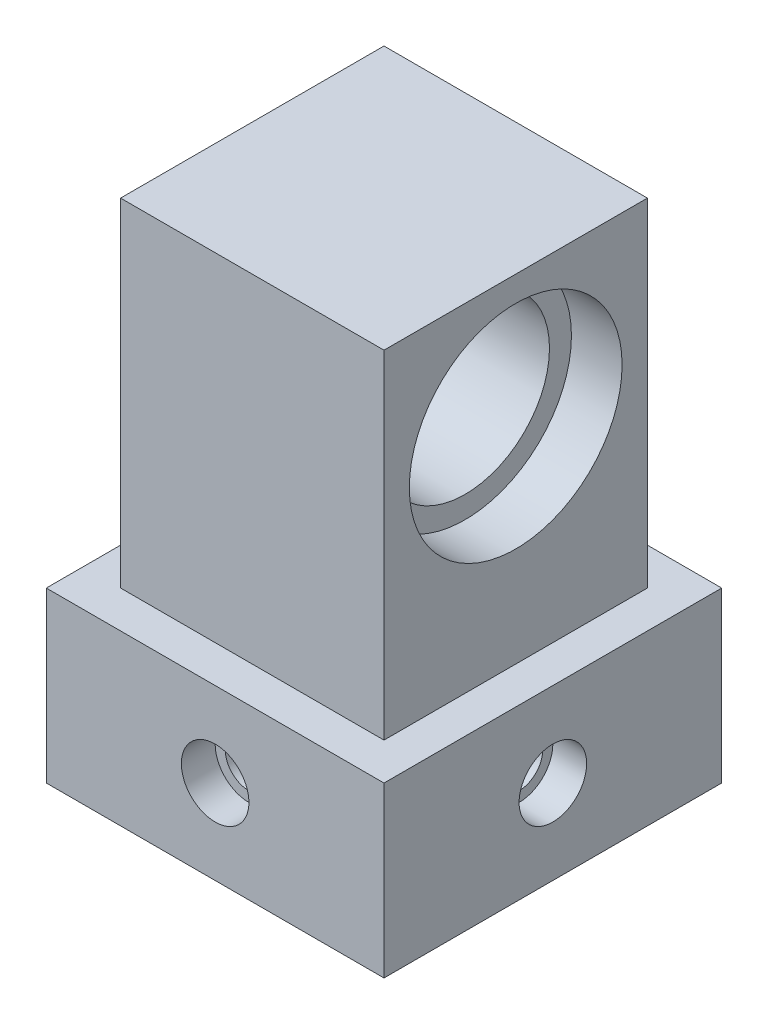
ISO-10303-21;
HEADER;
FILE_DESCRIPTION(('STEP AP214'),'2;1');
FILE_NAME('part.step','',(''),(''),'','','');
FILE_SCHEMA(('AUTOMOTIVE_DESIGN { 1 0 10303 214 1 1 1 1 }'));
ENDSEC;
DATA;
#1=APPLICATION_CONTEXT('core data for automotive mechanical design processes');
#2=APPLICATION_PROTOCOL_DEFINITION('international standard','automotive_design',2000,#1);
#3=PRODUCT_CONTEXT('',#1,'mechanical');
#4=PRODUCT('Part','Part','',(#3));
#5=PRODUCT_RELATED_PRODUCT_CATEGORY('part','',(#4));
#6=PRODUCT_DEFINITION_FORMATION('','',#4);
#7=PRODUCT_DEFINITION_CONTEXT('part definition',#1,'design');
#8=PRODUCT_DEFINITION('design','',#6,#7);
#9=PRODUCT_DEFINITION_SHAPE('','',#8);
#10=(LENGTH_UNIT() NAMED_UNIT(*) SI_UNIT(.MILLI.,.METRE.));
#11=(NAMED_UNIT(*) PLANE_ANGLE_UNIT() SI_UNIT($,.RADIAN.));
#12=(NAMED_UNIT(*) SI_UNIT($,.STERADIAN.) SOLID_ANGLE_UNIT());
#13=UNCERTAINTY_MEASURE_WITH_UNIT(LENGTH_MEASURE(1.E-05),#10,'distance_accuracy_value','');
#14=(GEOMETRIC_REPRESENTATION_CONTEXT(3) GLOBAL_UNCERTAINTY_ASSIGNED_CONTEXT((#13)) GLOBAL_UNIT_ASSIGNED_CONTEXT((#10,
#11,#12)) REPRESENTATION_CONTEXT('',''));
#15=CARTESIAN_POINT('',(0.,0.,0.));
#16=DIRECTION('',(0.,0.,1.));
#17=DIRECTION('',(1.,0.,0.));
#18=AXIS2_PLACEMENT_3D('',#15,#16,#17);
#19=CARTESIAN_POINT('',(0.,2.5,5.001));
#20=DIRECTION('',(0.,0.,-1.));
#21=DIRECTION('',(-1.,0.,0.));
#22=AXIS2_PLACEMENT_3D('',#19,#20,#21);
#23=CYLINDRICAL_SURFACE('',#22,0.7);
#24=CARTESIAN_POINT('',(0.,2.5,-3.1));
#25=DIRECTION('',(0.,0.,-1.));
#26=DIRECTION('',(-1.,0.,0.));
#27=AXIS2_PLACEMENT_3D('',#24,#25,#26);
#28=CIRCLE('',#27,0.7);
#29=CARTESIAN_POINT('',(-0.7,2.5,-3.1));
#30=VERTEX_POINT('',#29);
#31=EDGE_CURVE('E281',#30,#30,#28,.F.);
#32=ORIENTED_EDGE('',*,*,#31,.T.);
#33=EDGE_LOOP('',(#32));
#34=FACE_BOUND('',#33,.T.);
#35=CARTESIAN_POINT('',(0.,2.5,-4.));
#36=DIRECTION('',(0.,0.,-1.));
#37=DIRECTION('',(-1.,0.,0.));
#38=AXIS2_PLACEMENT_3D('',#35,#36,#37);
#39=CIRCLE('',#38,0.7);
#40=CARTESIAN_POINT('',(-0.7,2.5,-4.));
#41=VERTEX_POINT('',#40);
#42=EDGE_CURVE('E271',#41,#41,#39,.F.);
#43=ORIENTED_EDGE('',*,*,#42,.F.);
#44=EDGE_LOOP('',(#43));
#45=FACE_BOUND('',#44,.T.);
#46=ADVANCED_FACE('F59',(#34,#45),#23,.F.);
#47=CARTESIAN_POINT('',(-5.,11.1,0.));
#48=DIRECTION('',(1.,0.,0.));
#49=DIRECTION('',(0.,0.,-1.));
#50=AXIS2_PLACEMENT_3D('',#47,#48,#49);
#51=CYLINDRICAL_SURFACE('',#50,2.5);
#52=CARTESIAN_POINT('',(2.4,11.1,0.));
#53=DIRECTION('',(1.,0.,0.));
#54=DIRECTION('',(0.,0.,-1.));
#55=AXIS2_PLACEMENT_3D('',#52,#53,#54);
#56=CIRCLE('',#55,2.5);
#57=CARTESIAN_POINT('',(2.4,11.1,-2.5));
#58=VERTEX_POINT('',#57);
#59=EDGE_CURVE('E343',#58,#58,#56,.T.);
#60=ORIENTED_EDGE('',*,*,#59,.T.);
#61=EDGE_LOOP('',(#60));
#62=FACE_BOUND('',#61,.T.);
#63=CARTESIAN_POINT('',(-2.4,11.1,0.));
#64=DIRECTION('',(-1.,0.,0.));
#65=DIRECTION('',(0.,0.,1.));
#66=AXIS2_PLACEMENT_3D('',#63,#64,#65);
#67=CIRCLE('',#66,2.5);
#68=CARTESIAN_POINT('',(-2.4,11.1,2.5));
#69=VERTEX_POINT('',#68);
#70=EDGE_CURVE('E327',#69,#69,#67,.T.);
#71=ORIENTED_EDGE('',*,*,#70,.T.);
#72=EDGE_LOOP('',(#71));
#73=FACE_BOUND('',#72,.T.);
#74=ADVANCED_FACE('F379',(#62,#73),#51,.F.);
#75=CARTESIAN_POINT('',(0.,5.,0.));
#76=DIRECTION('',(0.,-1.,0.));
#77=DIRECTION('',(0.,0.,-1.));
#78=AXIS2_PLACEMENT_3D('',#75,#76,#77);
#79=PLANE('',#78);
#80=DIRECTION('',(0.,0.,1.));
#81=VECTOR('',#80,1.);
#82=CARTESIAN_POINT('',(-5.,5.,0.));
#83=LINE('',#82,#81);
#84=CARTESIAN_POINT('',(-5.,5.,-5.));
#85=VERTEX_POINT('',#84);
#86=CARTESIAN_POINT('',(-5.,5.,5.));
#87=VERTEX_POINT('',#86);
#88=EDGE_CURVE('E188',#85,#87,#83,.T.);
#89=ORIENTED_EDGE('',*,*,#88,.T.);
#90=DIRECTION('',(-1.,0.,0.));
#91=VECTOR('',#90,1.);
#92=CARTESIAN_POINT('',(0.,5.,5.));
#93=LINE('',#92,#91);
#94=CARTESIAN_POINT('',(5.,5.,5.));
#95=VERTEX_POINT('',#94);
#96=EDGE_CURVE('E193',#95,#87,#93,.T.);
#97=ORIENTED_EDGE('',*,*,#96,.F.);
#98=DIRECTION('',(0.,0.,1.));
#99=VECTOR('',#98,1.);
#100=CARTESIAN_POINT('',(5.,5.,0.));
#101=LINE('',#100,#99);
#102=CARTESIAN_POINT('',(5.,5.,-5.));
#103=VERTEX_POINT('',#102);
#104=EDGE_CURVE('E197',#103,#95,#101,.T.);
#105=ORIENTED_EDGE('',*,*,#104,.F.);
#106=DIRECTION('',(-1.,0.,0.));
#107=VECTOR('',#106,1.);
#108=CARTESIAN_POINT('',(0.,5.,-5.));
#109=LINE('',#108,#107);
#110=EDGE_CURVE('E201',#103,#85,#109,.T.);
#111=ORIENTED_EDGE('',*,*,#110,.T.);
#112=EDGE_LOOP('',(#89,#97,#105,#111));
#113=FACE_BOUND('',#112,.T.);
#114=DIRECTION('',(1.,0.,0.));
#115=VECTOR('',#114,1.);
#116=CARTESIAN_POINT('',(-3.9,5.,3.9));
#117=LINE('',#116,#115);
#118=CARTESIAN_POINT('',(-3.9,5.,3.9));
#119=VERTEX_POINT('',#118);
#120=CARTESIAN_POINT('',(3.9,5.,3.9));
#121=VERTEX_POINT('',#120);
#122=EDGE_CURVE('E77',#119,#121,#117,.T.);
#123=ORIENTED_EDGE('',*,*,#122,.F.);
#124=DIRECTION('',(0.,0.,-1.));
#125=VECTOR('',#124,1.);
#126=CARTESIAN_POINT('',(-3.9,5.,3.9));
#127=LINE('',#126,#125);
#128=CARTESIAN_POINT('',(-3.9,5.,-3.9));
#129=VERTEX_POINT('',#128);
#130=EDGE_CURVE('E82',#119,#129,#127,.T.);
#131=ORIENTED_EDGE('',*,*,#130,.T.);
#132=DIRECTION('',(1.,0.,0.));
#133=VECTOR('',#132,1.);
#134=CARTESIAN_POINT('',(-3.9,5.,-3.9));
#135=LINE('',#134,#133);
#136=CARTESIAN_POINT('',(3.9,5.,-3.9));
#137=VERTEX_POINT('',#136);
#138=EDGE_CURVE('E364',#129,#137,#135,.T.);
#139=ORIENTED_EDGE('',*,*,#138,.T.);
#140=DIRECTION('',(0.,0.,-1.));
#141=VECTOR('',#140,1.);
#142=CARTESIAN_POINT('',(3.9,5.,3.9));
#143=LINE('',#142,#141);
#144=EDGE_CURVE('E361',#121,#137,#143,.T.);
#145=ORIENTED_EDGE('',*,*,#144,.F.);
#146=EDGE_LOOP('',(#123,#131,#139,#145));
#147=FACE_BOUND('',#146,.T.);
#148=ADVANCED_FACE('F376',(#113,#147),#79,.F.);
#149=CARTESIAN_POINT('',(0.,4.,5.));
#150=DIRECTION('',(0.,0.,-1.));
#151=DIRECTION('',(-1.,0.,0.));
#152=AXIS2_PLACEMENT_3D('',#149,#150,#151);
#153=PLANE('',#152);
#154=CARTESIAN_POINT('',(0.,2.5,5.));
#155=DIRECTION('',(0.,0.,-1.));
#156=DIRECTION('',(-1.,0.,0.));
#157=AXIS2_PLACEMENT_3D('',#154,#155,#156);
#158=CIRCLE('',#157,1.);
#159=CARTESIAN_POINT('',(-1.,2.5,5.));
#160=VERTEX_POINT('',#159);
#161=EDGE_CURVE('E292',#160,#160,#158,.T.);
#162=ORIENTED_EDGE('',*,*,#161,.T.);
#163=EDGE_LOOP('',(#162));
#164=FACE_BOUND('',#163,.T.);
#165=DIRECTION('',(1.,0.,0.));
#166=VECTOR('',#165,1.);
#167=CARTESIAN_POINT('',(0.,0.,5.));
#168=LINE('',#167,#166);
#169=CARTESIAN_POINT('',(-5.,0.,5.));
#170=VERTEX_POINT('',#169);
#171=CARTESIAN_POINT('',(5.,0.,5.));
#172=VERTEX_POINT('',#171);
#173=EDGE_CURVE('E237',#170,#172,#168,.T.);
#174=ORIENTED_EDGE('',*,*,#173,.T.);
#175=DIRECTION('',(0.,-1.,0.));
#176=VECTOR('',#175,1.);
#177=CARTESIAN_POINT('',(5.,4.,5.));
#178=LINE('',#177,#176);
#179=EDGE_CURVE('E12',#95,#172,#178,.T.);
#180=ORIENTED_EDGE('',*,*,#179,.F.);
#181=ORIENTED_EDGE('',*,*,#96,.T.);
#182=DIRECTION('',(0.,-1.,0.));
#183=VECTOR('',#182,1.);
#184=CARTESIAN_POINT('',(-5.,4.,5.));
#185=LINE('',#184,#183);
#186=EDGE_CURVE('E252',#87,#170,#185,.T.);
#187=ORIENTED_EDGE('',*,*,#186,.T.);
#188=EDGE_LOOP('',(#174,#180,#181,#187));
#189=FACE_BOUND('',#188,.T.);
#190=ADVANCED_FACE('F378',(#164,#189),#153,.F.);
#191=CARTESIAN_POINT('',(5.,4.,0.));
#192=DIRECTION('',(-1.,0.,0.));
#193=DIRECTION('',(0.,0.,1.));
#194=AXIS2_PLACEMENT_3D('',#191,#192,#193);
#195=PLANE('',#194);
#196=CARTESIAN_POINT('',(5.,2.5,0.));
#197=DIRECTION('',(1.,0.,0.));
#198=DIRECTION('',(0.,0.,-1.));
#199=AXIS2_PLACEMENT_3D('',#196,#197,#198);
#200=CIRCLE('',#199,1.);
#201=CARTESIAN_POINT('',(5.,2.5,-1.));
#202=VERTEX_POINT('',#201);
#203=EDGE_CURVE('E319',#202,#202,#200,.T.);
#204=ORIENTED_EDGE('',*,*,#203,.F.);
#205=EDGE_LOOP('',(#204));
#206=FACE_BOUND('',#205,.T.);
#207=DIRECTION('',(0.,0.,-1.));
#208=VECTOR('',#207,1.);
#209=CARTESIAN_POINT('',(5.,0.,0.));
#210=LINE('',#209,#208);
#211=CARTESIAN_POINT('',(5.,0.,-5.));
#212=VERTEX_POINT('',#211);
#213=EDGE_CURVE('E241',#172,#212,#210,.T.);
#214=ORIENTED_EDGE('',*,*,#213,.T.);
#215=DIRECTION('',(0.,-1.,0.));
#216=VECTOR('',#215,1.);
#217=CARTESIAN_POINT('',(5.,4.,-5.));
#218=LINE('',#217,#216);
#219=EDGE_CURVE('E69',#103,#212,#218,.T.);
#220=ORIENTED_EDGE('',*,*,#219,.F.);
#221=ORIENTED_EDGE('',*,*,#104,.T.);
#222=ORIENTED_EDGE('',*,*,#179,.T.);
#223=EDGE_LOOP('',(#214,#220,#221,#222));
#224=FACE_BOUND('',#223,.T.);
#225=ADVANCED_FACE('F387',(#206,#224),#195,.F.);
#226=CARTESIAN_POINT('',(0.,4.,-5.));
#227=DIRECTION('',(0.,0.,-1.));
#228=DIRECTION('',(-1.,0.,0.));
#229=AXIS2_PLACEMENT_3D('',#226,#227,#228);
#230=PLANE('',#229);
#231=CARTESIAN_POINT('',(0.,2.5,-5.));
#232=DIRECTION('',(0.,0.,-1.));
#233=DIRECTION('',(-1.,0.,0.));
#234=AXIS2_PLACEMENT_3D('',#231,#232,#233);
#235=CIRCLE('',#234,1.);
#236=CARTESIAN_POINT('',(-1.,2.5,-5.));
#237=VERTEX_POINT('',#236);
#238=EDGE_CURVE('E284',#237,#237,#235,.T.);
#239=ORIENTED_EDGE('',*,*,#238,.F.);
#240=EDGE_LOOP('',(#239));
#241=FACE_BOUND('',#240,.T.);
#242=DIRECTION('',(1.,0.,0.));
#243=VECTOR('',#242,1.);
#244=CARTESIAN_POINT('',(0.,0.,-5.));
#245=LINE('',#244,#243);
#246=CARTESIAN_POINT('',(-5.,0.,-5.));
#247=VERTEX_POINT('',#246);
#248=EDGE_CURVE('E245',#247,#212,#245,.T.);
#249=ORIENTED_EDGE('',*,*,#248,.F.);
#250=DIRECTION('',(0.,-1.,0.));
#251=VECTOR('',#250,1.);
#252=CARTESIAN_POINT('',(-5.,4.,-5.));
#253=LINE('',#252,#251);
#254=EDGE_CURVE('E255',#85,#247,#253,.T.);
#255=ORIENTED_EDGE('',*,*,#254,.F.);
#256=ORIENTED_EDGE('',*,*,#110,.F.);
#257=ORIENTED_EDGE('',*,*,#219,.T.);
#258=EDGE_LOOP('',(#249,#255,#256,#257));
#259=FACE_BOUND('',#258,.T.);
#260=ADVANCED_FACE('F516',(#241,#259),#230,.T.);
#261=CARTESIAN_POINT('',(3.1,4.,0.));
#262=DIRECTION('',(-1.,0.,0.));
#263=DIRECTION('',(0.,0.,1.));
#264=AXIS2_PLACEMENT_3D('',#261,#262,#263);
#265=PLANE('',#264);
#266=CARTESIAN_POINT('',(3.1,2.5,0.));
#267=DIRECTION('',(-1.,0.,0.));
#268=DIRECTION('',(0.,0.,1.));
#269=AXIS2_PLACEMENT_3D('',#266,#267,#268);
#270=CIRCLE('',#269,0.7);
#271=CARTESIAN_POINT('',(3.1,2.5,0.7));
#272=VERTEX_POINT('',#271);
#273=EDGE_CURVE('E306',#272,#272,#270,.F.);
#274=ORIENTED_EDGE('',*,*,#273,.T.);
#275=EDGE_LOOP('',(#274));
#276=FACE_BOUND('',#275,.T.);
#277=DIRECTION('',(0.,0.,-1.));
#278=VECTOR('',#277,1.);
#279=CARTESIAN_POINT('',(3.1,0.,0.));
#280=LINE('',#279,#278);
#281=CARTESIAN_POINT('',(3.1,0.,3.1));
#282=VERTEX_POINT('',#281);
#283=CARTESIAN_POINT('',(3.1,0.,-3.1));
#284=VERTEX_POINT('',#283);
#285=EDGE_CURVE('E205',#282,#284,#280,.T.);
#286=ORIENTED_EDGE('',*,*,#285,.F.);
#287=DIRECTION('',(0.,-1.,0.));
#288=VECTOR('',#287,1.);
#289=CARTESIAN_POINT('',(3.1,4.,3.1));
#290=LINE('',#289,#288);
#291=CARTESIAN_POINT('',(3.1,4.,3.1));
#292=VERTEX_POINT('',#291);
#293=EDGE_CURVE('E256',#292,#282,#290,.T.);
#294=ORIENTED_EDGE('',*,*,#293,.F.);
#295=DIRECTION('',(0.,0.,-1.));
#296=VECTOR('',#295,1.);
#297=CARTESIAN_POINT('',(3.1,4.,0.));
#298=LINE('',#297,#296);
#299=CARTESIAN_POINT('',(3.1,4.,-3.1));
#300=VERTEX_POINT('',#299);
#301=EDGE_CURVE('E206',#292,#300,#298,.T.);
#302=ORIENTED_EDGE('',*,*,#301,.T.);
#303=DIRECTION('',(0.,-1.,0.));
#304=VECTOR('',#303,1.);
#305=CARTESIAN_POINT('',(3.1,4.,-3.1));
#306=LINE('',#305,#304);
#307=EDGE_CURVE('E222',#300,#284,#306,.T.);
#308=ORIENTED_EDGE('',*,*,#307,.T.);
#309=EDGE_LOOP('',(#286,#294,#302,#308));
#310=FACE_BOUND('',#309,.T.);
#311=ADVANCED_FACE('F61',(#276,#310),#265,.T.);
#312=CARTESIAN_POINT('',(0.,4.,3.1));
#313=DIRECTION('',(0.,0.,-1.));
#314=DIRECTION('',(-1.,0.,0.));
#315=AXIS2_PLACEMENT_3D('',#312,#313,#314);
#316=PLANE('',#315);
#317=CARTESIAN_POINT('',(0.,2.5,3.1));
#318=DIRECTION('',(0.,0.,-1.));
#319=DIRECTION('',(-1.,0.,0.));
#320=AXIS2_PLACEMENT_3D('',#317,#318,#319);
#321=CIRCLE('',#320,0.7);
#322=CARTESIAN_POINT('',(-0.7,2.5,3.1));
#323=VERTEX_POINT('',#322);
#324=EDGE_CURVE('E274',#323,#323,#321,.T.);
#325=ORIENTED_EDGE('',*,*,#324,.F.);
#326=EDGE_LOOP('',(#325));
#327=FACE_BOUND('',#326,.T.);
#328=DIRECTION('',(1.,0.,0.));
#329=VECTOR('',#328,1.);
#330=CARTESIAN_POINT('',(0.,0.,3.1));
#331=LINE('',#330,#329);
#332=CARTESIAN_POINT('',(-3.1,0.,3.1));
#333=VERTEX_POINT('',#332);
#334=EDGE_CURVE('E226',#333,#282,#331,.T.);
#335=ORIENTED_EDGE('',*,*,#334,.F.);
#336=DIRECTION('',(0.,-1.,0.));
#337=VECTOR('',#336,1.);
#338=CARTESIAN_POINT('',(-3.1,4.,3.1));
#339=LINE('',#338,#337);
#340=CARTESIAN_POINT('',(-3.1,4.,3.1));
#341=VERTEX_POINT('',#340);
#342=EDGE_CURVE('E267',#341,#333,#339,.T.);
#343=ORIENTED_EDGE('',*,*,#342,.F.);
#344=DIRECTION('',(1.,0.,0.));
#345=VECTOR('',#344,1.);
#346=CARTESIAN_POINT('',(0.,4.,3.1));
#347=LINE('',#346,#345);
#348=EDGE_CURVE('E209',#341,#292,#347,.T.);
#349=ORIENTED_EDGE('',*,*,#348,.T.);
#350=ORIENTED_EDGE('',*,*,#293,.T.);
#351=EDGE_LOOP('',(#335,#343,#349,#350));
#352=FACE_BOUND('',#351,.T.);
#353=ADVANCED_FACE('F561',(#327,#352),#316,.T.);
#354=CARTESIAN_POINT('',(-3.1,4.,0.));
#355=DIRECTION('',(-1.,0.,0.));
#356=DIRECTION('',(0.,0.,1.));
#357=AXIS2_PLACEMENT_3D('',#354,#355,#356);
#358=PLANE('',#357);
#359=CARTESIAN_POINT('',(-3.1,2.5,0.));
#360=DIRECTION('',(-1.,0.,0.));
#361=DIRECTION('',(0.,0.,1.));
#362=AXIS2_PLACEMENT_3D('',#359,#360,#361);
#363=CIRCLE('',#362,0.7);
#364=CARTESIAN_POINT('',(-3.1,2.5,0.7));
#365=VERTEX_POINT('',#364);
#366=EDGE_CURVE('E298',#365,#365,#363,.F.);
#367=ORIENTED_EDGE('',*,*,#366,.F.);
#368=EDGE_LOOP('',(#367));
#369=FACE_BOUND('',#368,.T.);
#370=DIRECTION('',(0.,0.,-1.));
#371=VECTOR('',#370,1.);
#372=CARTESIAN_POINT('',(-3.1,0.,0.));
#373=LINE('',#372,#371);
#374=CARTESIAN_POINT('',(-3.1,0.,-3.1));
#375=VERTEX_POINT('',#374);
#376=EDGE_CURVE('E230',#333,#375,#373,.T.);
#377=ORIENTED_EDGE('',*,*,#376,.T.);
#378=DIRECTION('',(0.,-1.,0.));
#379=VECTOR('',#378,1.);
#380=CARTESIAN_POINT('',(-3.1,4.,-3.1));
#381=LINE('',#380,#379);
#382=CARTESIAN_POINT('',(-3.1,4.,-3.1));
#383=VERTEX_POINT('',#382);
#384=EDGE_CURVE('E263',#383,#375,#381,.T.);
#385=ORIENTED_EDGE('',*,*,#384,.F.);
#386=DIRECTION('',(0.,0.,-1.));
#387=VECTOR('',#386,1.);
#388=CARTESIAN_POINT('',(-3.1,4.,0.));
#389=LINE('',#388,#387);
#390=EDGE_CURVE('E214',#341,#383,#389,.T.);
#391=ORIENTED_EDGE('',*,*,#390,.F.);
#392=ORIENTED_EDGE('',*,*,#342,.T.);
#393=EDGE_LOOP('',(#377,#385,#391,#392));
#394=FACE_BOUND('',#393,.T.);
#395=ADVANCED_FACE('F572',(#369,#394),#358,.F.);
#396=CARTESIAN_POINT('',(0.,4.,-3.1));
#397=DIRECTION('',(0.,0.,-1.));
#398=DIRECTION('',(-1.,0.,0.));
#399=AXIS2_PLACEMENT_3D('',#396,#397,#398);
#400=PLANE('',#399);
#401=ORIENTED_EDGE('',*,*,#31,.F.);
#402=EDGE_LOOP('',(#401));
#403=FACE_BOUND('',#402,.T.);
#404=DIRECTION('',(1.,0.,0.));
#405=VECTOR('',#404,1.);
#406=CARTESIAN_POINT('',(0.,0.,-3.1));
#407=LINE('',#406,#405);
#408=EDGE_CURVE('E233',#375,#284,#407,.T.);
#409=ORIENTED_EDGE('',*,*,#408,.T.);
#410=ORIENTED_EDGE('',*,*,#307,.F.);
#411=DIRECTION('',(1.,0.,0.));
#412=VECTOR('',#411,1.);
#413=CARTESIAN_POINT('',(0.,4.,-3.1));
#414=LINE('',#413,#412);
#415=EDGE_CURVE('E218',#383,#300,#414,.T.);
#416=ORIENTED_EDGE('',*,*,#415,.F.);
#417=ORIENTED_EDGE('',*,*,#384,.T.);
#418=EDGE_LOOP('',(#409,#410,#416,#417));
#419=FACE_BOUND('',#418,.T.);
#420=ADVANCED_FACE('F539',(#403,#419),#400,.F.);
#421=CARTESIAN_POINT('',(-5.,4.,0.));
#422=DIRECTION('',(-1.,0.,0.));
#423=DIRECTION('',(0.,0.,1.));
#424=AXIS2_PLACEMENT_3D('',#421,#422,#423);
#425=PLANE('',#424);
#426=CARTESIAN_POINT('',(-5.,2.5,0.));
#427=DIRECTION('',(-1.,0.,0.));
#428=DIRECTION('',(0.,0.,1.));
#429=AXIS2_PLACEMENT_3D('',#426,#427,#428);
#430=CIRCLE('',#429,1.);
#431=CARTESIAN_POINT('',(-5.,2.5,1.));
#432=VERTEX_POINT('',#431);
#433=EDGE_CURVE('E314',#432,#432,#430,.T.);
#434=ORIENTED_EDGE('',*,*,#433,.F.);
#435=EDGE_LOOP('',(#434));
#436=FACE_BOUND('',#435,.T.);
#437=DIRECTION('',(0.,0.,-1.));
#438=VECTOR('',#437,1.);
#439=CARTESIAN_POINT('',(-5.,0.,0.));
#440=LINE('',#439,#438);
#441=EDGE_CURVE('E210',#170,#247,#440,.T.);
#442=ORIENTED_EDGE('',*,*,#441,.F.);
#443=ORIENTED_EDGE('',*,*,#186,.F.);
#444=ORIENTED_EDGE('',*,*,#88,.F.);
#445=ORIENTED_EDGE('',*,*,#254,.T.);
#446=EDGE_LOOP('',(#442,#443,#444,#445));
#447=FACE_BOUND('',#446,.T.);
#448=ADVANCED_FACE('F534',(#436,#447),#425,.T.);
#449=CARTESIAN_POINT('',(0.,0.,0.));
#450=DIRECTION('',(0.,1.,0.));
#451=DIRECTION('',(0.,0.,1.));
#452=AXIS2_PLACEMENT_3D('',#449,#450,#451);
#453=PLANE('',#452);
#454=ORIENTED_EDGE('',*,*,#285,.T.);
#455=ORIENTED_EDGE('',*,*,#408,.F.);
#456=ORIENTED_EDGE('',*,*,#376,.F.);
#457=ORIENTED_EDGE('',*,*,#334,.T.);
#458=EDGE_LOOP('',(#454,#455,#456,#457));
#459=FACE_BOUND('',#458,.T.);
#460=ORIENTED_EDGE('',*,*,#173,.F.);
#461=ORIENTED_EDGE('',*,*,#441,.T.);
#462=ORIENTED_EDGE('',*,*,#248,.T.);
#463=ORIENTED_EDGE('',*,*,#213,.F.);
#464=EDGE_LOOP('',(#460,#461,#462,#463));
#465=FACE_BOUND('',#464,.T.);
#466=ADVANCED_FACE('F538',(#459,#465),#453,.F.);
#467=CARTESIAN_POINT('',(0.,4.,0.));
#468=DIRECTION('',(0.,-1.,0.));
#469=DIRECTION('',(0.,0.,-1.));
#470=AXIS2_PLACEMENT_3D('',#467,#468,#469);
#471=PLANE('',#470);
#472=CARTESIAN_POINT('',(0.,4.,0.));
#473=DIRECTION('',(0.,1.,0.));
#474=DIRECTION('',(0.,0.,1.));
#475=AXIS2_PLACEMENT_3D('',#472,#473,#474);
#476=CIRCLE('',#475,1.25);
#477=CARTESIAN_POINT('',(0.,4.,1.25));
#478=VERTEX_POINT('',#477);
#479=EDGE_CURVE('E175',#478,#478,#476,.T.);
#480=ORIENTED_EDGE('',*,*,#479,.T.);
#481=EDGE_LOOP('',(#480));
#482=FACE_BOUND('',#481,.T.);
#483=ORIENTED_EDGE('',*,*,#301,.F.);
#484=ORIENTED_EDGE('',*,*,#348,.F.);
#485=ORIENTED_EDGE('',*,*,#390,.T.);
#486=ORIENTED_EDGE('',*,*,#415,.T.);
#487=EDGE_LOOP('',(#483,#484,#485,#486));
#488=FACE_BOUND('',#487,.T.);
#489=ADVANCED_FACE('F459',(#482,#488),#471,.T.);
#490=CARTESIAN_POINT('',(0.,4.,0.));
#491=DIRECTION('',(0.,-1.,0.));
#492=DIRECTION('',(0.,0.,-1.));
#493=AXIS2_PLACEMENT_3D('',#490,#491,#492);
#494=CYLINDRICAL_SURFACE('',#493,1.25);
#495=ORIENTED_EDGE('',*,*,#479,.F.);
#496=EDGE_LOOP('',(#495));
#497=FACE_BOUND('',#496,.T.);
#498=CARTESIAN_POINT('',(0.,0.,0.));
#499=DIRECTION('',(0.,1.,0.));
#500=DIRECTION('',(0.,0.,1.));
#501=AXIS2_PLACEMENT_3D('',#498,#499,#500);
#502=CIRCLE('',#501,1.25);
#503=CARTESIAN_POINT('',(0.,0.,1.25));
#504=VERTEX_POINT('',#503);
#505=EDGE_CURVE('E180',#504,#504,#502,.T.);
#506=ORIENTED_EDGE('',*,*,#505,.T.);
#507=EDGE_LOOP('',(#506));
#508=FACE_BOUND('',#507,.T.);
#509=ADVANCED_FACE('F457',(#497,#508),#494,.T.);
#510=CARTESIAN_POINT('',(0.,0.,0.));
#511=DIRECTION('',(0.,1.,0.));
#512=DIRECTION('',(0.,0.,1.));
#513=AXIS2_PLACEMENT_3D('',#510,#511,#512);
#514=PLANE('',#513);
#515=ORIENTED_EDGE('',*,*,#505,.F.);
#516=EDGE_LOOP('',(#515));
#517=FACE_BOUND('',#516,.T.);
#518=ADVANCED_FACE('F456',(#517),#514,.F.);
#519=CARTESIAN_POINT('',(-3.9,15.,3.9));
#520=DIRECTION('',(0.,0.,-1.));
#521=DIRECTION('',(-1.,0.,0.));
#522=AXIS2_PLACEMENT_3D('',#519,#520,#521);
#523=PLANE('',#522);
#524=ORIENTED_EDGE('',*,*,#122,.T.);
#525=DIRECTION('',(0.,-1.,0.));
#526=VECTOR('',#525,1.);
#527=CARTESIAN_POINT('',(3.9,15.,3.9));
#528=LINE('',#527,#526);
#529=CARTESIAN_POINT('',(3.9,15.,3.9));
#530=VERTEX_POINT('',#529);
#531=EDGE_CURVE('E155',#530,#121,#528,.T.);
#532=ORIENTED_EDGE('',*,*,#531,.F.);
#533=DIRECTION('',(1.,0.,0.));
#534=VECTOR('',#533,1.);
#535=CARTESIAN_POINT('',(-3.9,15.,3.9));
#536=LINE('',#535,#534);
#537=CARTESIAN_POINT('',(-3.9,15.,3.9));
#538=VERTEX_POINT('',#537);
#539=EDGE_CURVE('E163',#538,#530,#536,.T.);
#540=ORIENTED_EDGE('',*,*,#539,.F.);
#541=DIRECTION('',(0.,-1.,0.));
#542=VECTOR('',#541,1.);
#543=CARTESIAN_POINT('',(-3.9,15.,3.9));
#544=LINE('',#543,#542);
#545=EDGE_CURVE('E358',#538,#119,#544,.T.);
#546=ORIENTED_EDGE('',*,*,#545,.T.);
#547=EDGE_LOOP('',(#524,#532,#540,#546));
#548=FACE_BOUND('',#547,.T.);
#549=ADVANCED_FACE('F173',(#548),#523,.F.);
#550=CARTESIAN_POINT('',(3.9,15.,3.9));
#551=DIRECTION('',(-1.,0.,0.));
#552=DIRECTION('',(0.,0.,1.));
#553=AXIS2_PLACEMENT_3D('',#550,#551,#552);
#554=PLANE('',#553);
#555=CARTESIAN_POINT('',(3.9,11.1,0.));
#556=DIRECTION('',(1.,0.,0.));
#557=DIRECTION('',(0.,0.,-1.));
#558=AXIS2_PLACEMENT_3D('',#555,#556,#557);
#559=CIRCLE('',#558,3.15);
#560=CARTESIAN_POINT('',(3.9,11.1,-3.15));
#561=VERTEX_POINT('',#560);
#562=EDGE_CURVE('E339',#561,#561,#559,.T.);
#563=ORIENTED_EDGE('',*,*,#562,.F.);
#564=EDGE_LOOP('',(#563));
#565=FACE_BOUND('',#564,.T.);
#566=ORIENTED_EDGE('',*,*,#144,.T.);
#567=DIRECTION('',(0.,-1.,0.));
#568=VECTOR('',#567,1.);
#569=CARTESIAN_POINT('',(3.9,15.,-3.9));
#570=LINE('',#569,#568);
#571=CARTESIAN_POINT('',(3.9,15.,-3.9));
#572=VERTEX_POINT('',#571);
#573=EDGE_CURVE('E157',#572,#137,#570,.T.);
#574=ORIENTED_EDGE('',*,*,#573,.F.);
#575=DIRECTION('',(0.,0.,-1.));
#576=VECTOR('',#575,1.);
#577=CARTESIAN_POINT('',(3.9,15.,3.9));
#578=LINE('',#577,#576);
#579=EDGE_CURVE('E150',#530,#572,#578,.T.);
#580=ORIENTED_EDGE('',*,*,#579,.F.);
#581=ORIENTED_EDGE('',*,*,#531,.T.);
#582=EDGE_LOOP('',(#566,#574,#580,#581));
#583=FACE_BOUND('',#582,.T.);
#584=ADVANCED_FACE('F153',(#565,#583),#554,.F.);
#585=CARTESIAN_POINT('',(-3.9,15.,-3.9));
#586=DIRECTION('',(0.,0.,-1.));
#587=DIRECTION('',(-1.,0.,0.));
#588=AXIS2_PLACEMENT_3D('',#585,#586,#587);
#589=PLANE('',#588);
#590=ORIENTED_EDGE('',*,*,#138,.F.);
#591=DIRECTION('',(0.,-1.,0.));
#592=VECTOR('',#591,1.);
#593=CARTESIAN_POINT('',(-3.9,15.,-3.9));
#594=LINE('',#593,#592);
#595=CARTESIAN_POINT('',(-3.9,15.,-3.9));
#596=VERTEX_POINT('',#595);
#597=EDGE_CURVE('E182',#596,#129,#594,.T.);
#598=ORIENTED_EDGE('',*,*,#597,.F.);
#599=DIRECTION('',(1.,0.,0.));
#600=VECTOR('',#599,1.);
#601=CARTESIAN_POINT('',(-3.9,15.,-3.9));
#602=LINE('',#601,#600);
#603=EDGE_CURVE('E162',#596,#572,#602,.T.);
#604=ORIENTED_EDGE('',*,*,#603,.T.);
#605=ORIENTED_EDGE('',*,*,#573,.T.);
#606=EDGE_LOOP('',(#590,#598,#604,#605));
#607=FACE_BOUND('',#606,.T.);
#608=ADVANCED_FACE('F375',(#607),#589,.T.);
#609=CARTESIAN_POINT('',(-3.9,15.,3.9));
#610=DIRECTION('',(-1.,0.,0.));
#611=DIRECTION('',(0.,0.,1.));
#612=AXIS2_PLACEMENT_3D('',#609,#610,#611);
#613=PLANE('',#612);
#614=CARTESIAN_POINT('',(-3.9,11.1,0.));
#615=DIRECTION('',(-1.,0.,0.));
#616=DIRECTION('',(0.,0.,1.));
#617=AXIS2_PLACEMENT_3D('',#614,#615,#616);
#618=CIRCLE('',#617,3.15);
#619=CARTESIAN_POINT('',(-3.9,11.1,3.15));
#620=VERTEX_POINT('',#619);
#621=EDGE_CURVE('E334',#620,#620,#618,.T.);
#622=ORIENTED_EDGE('',*,*,#621,.F.);
#623=EDGE_LOOP('',(#622));
#624=FACE_BOUND('',#623,.T.);
#625=ORIENTED_EDGE('',*,*,#130,.F.);
#626=ORIENTED_EDGE('',*,*,#545,.F.);
#627=DIRECTION('',(0.,0.,-1.));
#628=VECTOR('',#627,1.);
#629=CARTESIAN_POINT('',(-3.9,15.,3.9));
#630=LINE('',#629,#628);
#631=EDGE_CURVE('E169',#538,#596,#630,.T.);
#632=ORIENTED_EDGE('',*,*,#631,.T.);
#633=ORIENTED_EDGE('',*,*,#597,.T.);
#634=EDGE_LOOP('',(#625,#626,#632,#633));
#635=FACE_BOUND('',#634,.T.);
#636=ADVANCED_FACE('F373',(#624,#635),#613,.T.);
#637=CARTESIAN_POINT('',(0.,15.,0.));
#638=DIRECTION('',(0.,1.,0.));
#639=DIRECTION('',(0.,0.,1.));
#640=AXIS2_PLACEMENT_3D('',#637,#638,#639);
#641=PLANE('',#640);
#642=ORIENTED_EDGE('',*,*,#539,.T.);
#643=ORIENTED_EDGE('',*,*,#579,.T.);
#644=ORIENTED_EDGE('',*,*,#603,.F.);
#645=ORIENTED_EDGE('',*,*,#631,.F.);
#646=EDGE_LOOP('',(#642,#643,#644,#645));
#647=FACE_BOUND('',#646,.T.);
#648=ADVANCED_FACE('F167',(#647),#641,.T.);
#649=CARTESIAN_POINT('',(2.4,11.1,0.));
#650=DIRECTION('',(1.,0.,0.));
#651=DIRECTION('',(0.,0.,-1.));
#652=AXIS2_PLACEMENT_3D('',#649,#650,#651);
#653=CYLINDRICAL_SURFACE('',#652,3.15);
#654=CARTESIAN_POINT('',(2.4,11.1,0.));
#655=DIRECTION('',(1.,0.,0.));
#656=DIRECTION('',(0.,0.,-1.));
#657=AXIS2_PLACEMENT_3D('',#654,#655,#656);
#658=CIRCLE('',#657,3.15);
#659=CARTESIAN_POINT('',(2.4,11.1,-3.15));
#660=VERTEX_POINT('',#659);
#661=EDGE_CURVE('E347',#660,#660,#658,.T.);
#662=ORIENTED_EDGE('',*,*,#661,.F.);
#663=EDGE_LOOP('',(#662));
#664=FACE_BOUND('',#663,.T.);
#665=ORIENTED_EDGE('',*,*,#562,.T.);
#666=EDGE_LOOP('',(#665));
#667=FACE_BOUND('',#666,.T.);
#668=ADVANCED_FACE('F439',(#664,#667),#653,.F.);
#669=CARTESIAN_POINT('',(2.4,0.,0.));
#670=DIRECTION('',(1.,0.,0.));
#671=DIRECTION('',(0.,0.,-1.));
#672=AXIS2_PLACEMENT_3D('',#669,#670,#671);
#673=PLANE('',#672);
#674=ORIENTED_EDGE('',*,*,#59,.F.);
#675=EDGE_LOOP('',(#674));
#676=FACE_BOUND('',#675,.T.);
#677=ORIENTED_EDGE('',*,*,#661,.T.);
#678=EDGE_LOOP('',(#677));
#679=FACE_BOUND('',#678,.T.);
#680=ADVANCED_FACE('F435',(#676,#679),#673,.T.);
#681=CARTESIAN_POINT('',(-2.4,11.1,0.));
#682=DIRECTION('',(-1.,0.,0.));
#683=DIRECTION('',(0.,0.,1.));
#684=AXIS2_PLACEMENT_3D('',#681,#682,#683);
#685=CYLINDRICAL_SURFACE('',#684,3.15);
#686=CARTESIAN_POINT('',(-2.4,11.1,0.));
#687=DIRECTION('',(-1.,0.,0.));
#688=DIRECTION('',(0.,0.,1.));
#689=AXIS2_PLACEMENT_3D('',#686,#687,#688);
#690=CIRCLE('',#689,3.15);
#691=CARTESIAN_POINT('',(-2.4,11.1,3.15));
#692=VERTEX_POINT('',#691);
#693=EDGE_CURVE('E335',#692,#692,#690,.T.);
#694=ORIENTED_EDGE('',*,*,#693,.F.);
#695=EDGE_LOOP('',(#694));
#696=FACE_BOUND('',#695,.T.);
#697=ORIENTED_EDGE('',*,*,#621,.T.);
#698=EDGE_LOOP('',(#697));
#699=FACE_BOUND('',#698,.T.);
#700=ADVANCED_FACE('F431',(#696,#699),#685,.F.);
#701=CARTESIAN_POINT('',(-2.4,11.1,0.));
#702=DIRECTION('',(-1.,0.,0.));
#703=DIRECTION('',(0.,0.,1.));
#704=AXIS2_PLACEMENT_3D('',#701,#702,#703);
#705=PLANE('',#704);
#706=ORIENTED_EDGE('',*,*,#70,.F.);
#707=EDGE_LOOP('',(#706));
#708=FACE_BOUND('',#707,.T.);
#709=ORIENTED_EDGE('',*,*,#693,.T.);
#710=EDGE_LOOP('',(#709));
#711=FACE_BOUND('',#710,.T.);
#712=ADVANCED_FACE('F428',(#708,#711),#705,.T.);
#713=CARTESIAN_POINT('',(4.,2.5,0.));
#714=DIRECTION('',(1.,0.,0.));
#715=DIRECTION('',(0.,0.,-1.));
#716=AXIS2_PLACEMENT_3D('',#713,#714,#715);
#717=CYLINDRICAL_SURFACE('',#716,1.);
#718=CARTESIAN_POINT('',(4.,2.5,0.));
#719=DIRECTION('',(1.,0.,0.));
#720=DIRECTION('',(0.,0.,-1.));
#721=AXIS2_PLACEMENT_3D('',#718,#719,#720);
#722=CIRCLE('',#721,1.);
#723=CARTESIAN_POINT('',(4.,2.5,-1.));
#724=VERTEX_POINT('',#723);
#725=EDGE_CURVE('E323',#724,#724,#722,.T.);
#726=ORIENTED_EDGE('',*,*,#725,.F.);
#727=EDGE_LOOP('',(#726));
#728=FACE_BOUND('',#727,.T.);
#729=ORIENTED_EDGE('',*,*,#203,.T.);
#730=EDGE_LOOP('',(#729));
#731=FACE_BOUND('',#730,.T.);
#732=ADVANCED_FACE('F425',(#728,#731),#717,.F.);
#733=CARTESIAN_POINT('',(4.,2.5,0.));
#734=DIRECTION('',(1.,0.,0.));
#735=DIRECTION('',(0.,0.,-1.));
#736=AXIS2_PLACEMENT_3D('',#733,#734,#735);
#737=PLANE('',#736);
#738=CARTESIAN_POINT('',(4.,2.5,0.));
#739=DIRECTION('',(1.,0.,0.));
#740=DIRECTION('',(0.,0.,-1.));
#741=AXIS2_PLACEMENT_3D('',#738,#739,#740);
#742=CIRCLE('',#741,0.7);
#743=CARTESIAN_POINT('',(4.,2.5,-0.7));
#744=VERTEX_POINT('',#743);
#745=EDGE_CURVE('E310',#744,#744,#742,.F.);
#746=ORIENTED_EDGE('',*,*,#745,.T.);
#747=EDGE_LOOP('',(#746));
#748=FACE_BOUND('',#747,.T.);
#749=ORIENTED_EDGE('',*,*,#725,.T.);
#750=EDGE_LOOP('',(#749));
#751=FACE_BOUND('',#750,.T.);
#752=ADVANCED_FACE('F421',(#748,#751),#737,.T.);
#753=CARTESIAN_POINT('',(-4.,2.5,0.));
#754=DIRECTION('',(-1.,0.,0.));
#755=DIRECTION('',(0.,0.,1.));
#756=AXIS2_PLACEMENT_3D('',#753,#754,#755);
#757=CYLINDRICAL_SURFACE('',#756,1.);
#758=CARTESIAN_POINT('',(-4.,2.5,0.));
#759=DIRECTION('',(-1.,0.,0.));
#760=DIRECTION('',(0.,0.,1.));
#761=AXIS2_PLACEMENT_3D('',#758,#759,#760);
#762=CIRCLE('',#761,1.);
#763=CARTESIAN_POINT('',(-4.,2.5,1.));
#764=VERTEX_POINT('',#763);
#765=EDGE_CURVE('E315',#764,#764,#762,.T.);
#766=ORIENTED_EDGE('',*,*,#765,.F.);
#767=EDGE_LOOP('',(#766));
#768=FACE_BOUND('',#767,.T.);
#769=ORIENTED_EDGE('',*,*,#433,.T.);
#770=EDGE_LOOP('',(#769));
#771=FACE_BOUND('',#770,.T.);
#772=ADVANCED_FACE('F417',(#768,#771),#757,.F.);
#773=CARTESIAN_POINT('',(-4.,2.5,0.));
#774=DIRECTION('',(-1.,0.,0.));
#775=DIRECTION('',(0.,0.,1.));
#776=AXIS2_PLACEMENT_3D('',#773,#774,#775);
#777=PLANE('',#776);
#778=CARTESIAN_POINT('',(-4.,2.5,0.));
#779=DIRECTION('',(-1.,0.,0.));
#780=DIRECTION('',(0.,0.,1.));
#781=AXIS2_PLACEMENT_3D('',#778,#779,#780);
#782=CIRCLE('',#781,0.7);
#783=CARTESIAN_POINT('',(-4.,2.5,0.7));
#784=VERTEX_POINT('',#783);
#785=EDGE_CURVE('E302',#784,#784,#782,.F.);
#786=ORIENTED_EDGE('',*,*,#785,.T.);
#787=EDGE_LOOP('',(#786));
#788=FACE_BOUND('',#787,.T.);
#789=ORIENTED_EDGE('',*,*,#765,.T.);
#790=EDGE_LOOP('',(#789));
#791=FACE_BOUND('',#790,.T.);
#792=ADVANCED_FACE('F413',(#788,#791),#777,.T.);
#793=CARTESIAN_POINT('',(-5.001,2.5,0.));
#794=DIRECTION('',(1.,0.,0.));
#795=DIRECTION('',(0.,0.,-1.));
#796=AXIS2_PLACEMENT_3D('',#793,#794,#795);
#797=CYLINDRICAL_SURFACE('',#796,0.7);
#798=ORIENTED_EDGE('',*,*,#273,.F.);
#799=EDGE_LOOP('',(#798));
#800=FACE_BOUND('',#799,.T.);
#801=ORIENTED_EDGE('',*,*,#745,.F.);
#802=EDGE_LOOP('',(#801));
#803=FACE_BOUND('',#802,.T.);
#804=ADVANCED_FACE('F409',(#800,#803),#797,.F.);
#805=CARTESIAN_POINT('',(5.001,2.5,0.));
#806=DIRECTION('',(-1.,0.,0.));
#807=DIRECTION('',(0.,0.,1.));
#808=AXIS2_PLACEMENT_3D('',#805,#806,#807);
#809=CYLINDRICAL_SURFACE('',#808,0.7);
#810=ORIENTED_EDGE('',*,*,#785,.F.);
#811=EDGE_LOOP('',(#810));
#812=FACE_BOUND('',#811,.T.);
#813=ORIENTED_EDGE('',*,*,#366,.T.);
#814=EDGE_LOOP('',(#813));
#815=FACE_BOUND('',#814,.T.);
#816=ADVANCED_FACE('F406',(#812,#815),#809,.F.);
#817=CARTESIAN_POINT('',(0.,2.5,-5.001));
#818=DIRECTION('',(0.,0.,1.));
#819=DIRECTION('',(1.,0.,0.));
#820=AXIS2_PLACEMENT_3D('',#817,#818,#819);
#821=CYLINDRICAL_SURFACE('',#820,0.7);
#822=CARTESIAN_POINT('',(0.,2.5,4.));
#823=DIRECTION('',(0.,0.,-1.));
#824=DIRECTION('',(-1.,0.,0.));
#825=AXIS2_PLACEMENT_3D('',#822,#823,#824);
#826=CIRCLE('',#825,0.7);
#827=CARTESIAN_POINT('',(-0.7,2.5,4.));
#828=VERTEX_POINT('',#827);
#829=EDGE_CURVE('E63',#828,#828,#826,.T.);
#830=ORIENTED_EDGE('',*,*,#829,.F.);
#831=EDGE_LOOP('',(#830));
#832=FACE_BOUND('',#831,.T.);
#833=ORIENTED_EDGE('',*,*,#324,.T.);
#834=EDGE_LOOP('',(#833));
#835=FACE_BOUND('',#834,.T.);
#836=ADVANCED_FACE('F404',(#832,#835),#821,.F.);
#837=CARTESIAN_POINT('',(0.,2.5,-4.));
#838=DIRECTION('',(0.,0.,-1.));
#839=DIRECTION('',(-1.,0.,0.));
#840=AXIS2_PLACEMENT_3D('',#837,#838,#839);
#841=PLANE('',#840);
#842=CARTESIAN_POINT('',(0.,2.5,-4.));
#843=DIRECTION('',(0.,0.,-1.));
#844=DIRECTION('',(-1.,0.,0.));
#845=AXIS2_PLACEMENT_3D('',#842,#843,#844);
#846=CIRCLE('',#845,1.);
#847=CARTESIAN_POINT('',(-1.,2.5,-4.));
#848=VERTEX_POINT('',#847);
#849=EDGE_CURVE('E275',#848,#848,#846,.T.);
#850=ORIENTED_EDGE('',*,*,#849,.T.);
#851=EDGE_LOOP('',(#850));
#852=FACE_BOUND('',#851,.T.);
#853=ORIENTED_EDGE('',*,*,#42,.T.);
#854=EDGE_LOOP('',(#853));
#855=FACE_BOUND('',#854,.T.);
#856=ADVANCED_FACE('F609',(#852,#855),#841,.T.);
#857=CARTESIAN_POINT('',(0.,2.5,-4.));
#858=DIRECTION('',(0.,0.,-1.));
#859=DIRECTION('',(-1.,0.,0.));
#860=AXIS2_PLACEMENT_3D('',#857,#858,#859);
#861=CYLINDRICAL_SURFACE('',#860,1.);
#862=ORIENTED_EDGE('',*,*,#849,.F.);
#863=EDGE_LOOP('',(#862));
#864=FACE_BOUND('',#863,.T.);
#865=ORIENTED_EDGE('',*,*,#238,.T.);
#866=EDGE_LOOP('',(#865));
#867=FACE_BOUND('',#866,.T.);
#868=ADVANCED_FACE('F613',(#864,#867),#861,.F.);
#869=CARTESIAN_POINT('',(0.,2.5,4.));
#870=DIRECTION('',(0.,0.,1.));
#871=DIRECTION('',(1.,0.,0.));
#872=AXIS2_PLACEMENT_3D('',#869,#870,#871);
#873=CYLINDRICAL_SURFACE('',#872,1.);
#874=CARTESIAN_POINT('',(0.,2.5,4.));
#875=DIRECTION('',(0.,0.,-1.));
#876=DIRECTION('',(-1.,0.,0.));
#877=AXIS2_PLACEMENT_3D('',#874,#875,#876);
#878=CIRCLE('',#877,1.);
#879=CARTESIAN_POINT('',(-1.,2.5,4.));
#880=VERTEX_POINT('',#879);
#881=EDGE_CURVE('E659',#880,#880,#878,.T.);
#882=ORIENTED_EDGE('',*,*,#881,.T.);
#883=EDGE_LOOP('',(#882));
#884=FACE_BOUND('',#883,.T.);
#885=ORIENTED_EDGE('',*,*,#161,.F.);
#886=EDGE_LOOP('',(#885));
#887=FACE_BOUND('',#886,.T.);
#888=ADVANCED_FACE('F621',(#884,#887),#873,.F.);
#889=CARTESIAN_POINT('',(0.,2.5,4.));
#890=DIRECTION('',(0.,0.,-1.));
#891=DIRECTION('',(-1.,0.,0.));
#892=AXIS2_PLACEMENT_3D('',#889,#890,#891);
#893=PLANE('',#892);
#894=ORIENTED_EDGE('',*,*,#829,.T.);
#895=EDGE_LOOP('',(#894));
#896=FACE_BOUND('',#895,.T.);
#897=ORIENTED_EDGE('',*,*,#881,.F.);
#898=EDGE_LOOP('',(#897));
#899=FACE_BOUND('',#898,.T.);
#900=ADVANCED_FACE('F640',(#896,#899),#893,.F.);
#901=CLOSED_SHELL('',(#46,#74,#148,#190,#225,#260,#311,#353,#395,#420,#448,#466,#489,#509,#518,
#549,#584,#608,#636,#648,#668,#680,#700,#712,#732,#752,#772,#792,#804,#816,#836,#856,#868,#888,#900));
#902=MANIFOLD_SOLID_BREP('B2',#901);
#903=ADVANCED_BREP_SHAPE_REPRESENTATION('',(#18,#902),#14);
#904=SHAPE_DEFINITION_REPRESENTATION(#9,#903);
ENDSEC;
END-ISO-10303-21;
